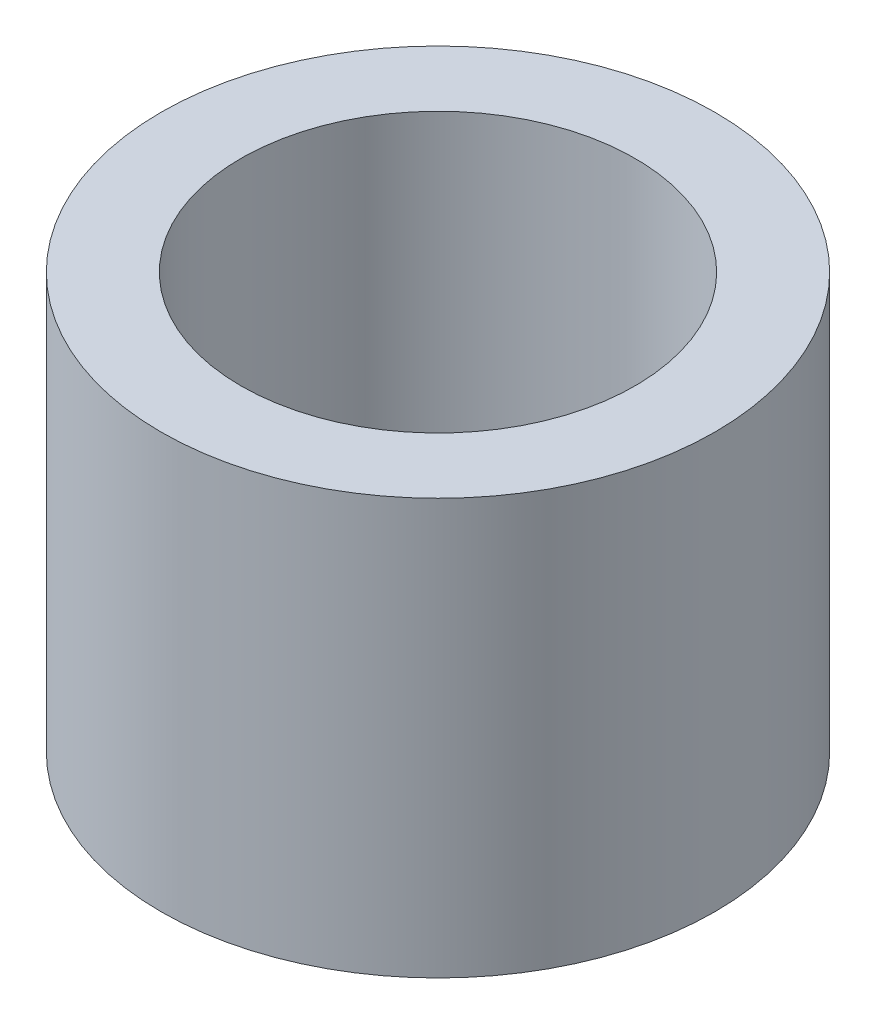
ISO-10303-21;
HEADER;
FILE_DESCRIPTION(('STEP AP214'),'2;1');
FILE_NAME('part.step','',(''),(''),'','','');
FILE_SCHEMA(('AUTOMOTIVE_DESIGN { 1 0 10303 214 1 1 1 1 }'));
ENDSEC;
DATA;
#1=APPLICATION_CONTEXT('core data for automotive mechanical design processes');
#2=APPLICATION_PROTOCOL_DEFINITION('international standard','automotive_design',2000,#1);
#3=PRODUCT_CONTEXT('',#1,'mechanical');
#4=PRODUCT('Part','Part','',(#3));
#5=PRODUCT_RELATED_PRODUCT_CATEGORY('part','',(#4));
#6=PRODUCT_DEFINITION_FORMATION('','',#4);
#7=PRODUCT_DEFINITION_CONTEXT('part definition',#1,'design');
#8=PRODUCT_DEFINITION('design','',#6,#7);
#9=PRODUCT_DEFINITION_SHAPE('','',#8);
#10=(LENGTH_UNIT() NAMED_UNIT(*) SI_UNIT(.MILLI.,.METRE.));
#11=(NAMED_UNIT(*) PLANE_ANGLE_UNIT() SI_UNIT($,.RADIAN.));
#12=(NAMED_UNIT(*) SI_UNIT($,.STERADIAN.) SOLID_ANGLE_UNIT());
#13=UNCERTAINTY_MEASURE_WITH_UNIT(LENGTH_MEASURE(1.E-05),#10,'distance_accuracy_value','');
#14=(GEOMETRIC_REPRESENTATION_CONTEXT(3) GLOBAL_UNCERTAINTY_ASSIGNED_CONTEXT((#13)) GLOBAL_UNIT_ASSIGNED_CONTEXT((#10,
#11,#12)) REPRESENTATION_CONTEXT('',''));
#15=CARTESIAN_POINT('',(0.,0.,0.));
#16=DIRECTION('',(0.,0.,1.));
#17=DIRECTION('',(1.,0.,0.));
#18=AXIS2_PLACEMENT_3D('',#15,#16,#17);
#19=CARTESIAN_POINT('',(0.,75.,0.));
#20=DIRECTION('',(0.,1.,0.));
#21=DIRECTION('',(0.,0.,1.));
#22=AXIS2_PLACEMENT_3D('',#19,#20,#21);
#23=PLANE('',#22);
#24=CARTESIAN_POINT('',(0.,75.,0.));
#25=DIRECTION('',(0.,1.,0.));
#26=DIRECTION('',(0.,0.,1.));
#27=AXIS2_PLACEMENT_3D('',#24,#25,#26);
#28=CIRCLE('',#27,50.);
#29=CARTESIAN_POINT('',(0.,75.,50.));
#30=VERTEX_POINT('',#29);
#31=EDGE_CURVE('E11',#30,#30,#28,.T.);
#32=ORIENTED_EDGE('',*,*,#31,.T.);
#33=EDGE_LOOP('',(#32));
#34=FACE_BOUND('',#33,.T.);
#35=CARTESIAN_POINT('',(0.,75.,0.));
#36=DIRECTION('',(0.,1.,0.));
#37=DIRECTION('',(0.,0.,1.));
#38=AXIS2_PLACEMENT_3D('',#35,#36,#37);
#39=CIRCLE('',#38,35.575);
#40=CARTESIAN_POINT('',(0.,75.,35.575));
#41=VERTEX_POINT('',#40);
#42=EDGE_CURVE('E56',#41,#41,#39,.T.);
#43=ORIENTED_EDGE('',*,*,#42,.F.);
#44=EDGE_LOOP('',(#43));
#45=FACE_BOUND('',#44,.T.);
#46=ADVANCED_FACE('F43',(#34,#45),#23,.T.);
#47=CARTESIAN_POINT('',(0.,0.,0.));
#48=DIRECTION('',(0.,1.,0.));
#49=DIRECTION('',(0.,0.,1.));
#50=AXIS2_PLACEMENT_3D('',#47,#48,#49);
#51=PLANE('',#50);
#52=CARTESIAN_POINT('',(0.,0.,0.));
#53=DIRECTION('',(0.,1.,0.));
#54=DIRECTION('',(0.,0.,1.));
#55=AXIS2_PLACEMENT_3D('',#52,#53,#54);
#56=CIRCLE('',#55,50.);
#57=CARTESIAN_POINT('',(0.,0.,50.));
#58=VERTEX_POINT('',#57);
#59=EDGE_CURVE('E47',#58,#58,#56,.T.);
#60=ORIENTED_EDGE('',*,*,#59,.F.);
#61=EDGE_LOOP('',(#60));
#62=FACE_BOUND('',#61,.T.);
#63=CARTESIAN_POINT('',(0.,0.,0.));
#64=DIRECTION('',(0.,1.,0.));
#65=DIRECTION('',(0.,0.,1.));
#66=AXIS2_PLACEMENT_3D('',#63,#64,#65);
#67=CIRCLE('',#66,35.575);
#68=CARTESIAN_POINT('',(0.,0.,35.575));
#69=VERTEX_POINT('',#68);
#70=EDGE_CURVE('E58',#69,#69,#67,.T.);
#71=ORIENTED_EDGE('',*,*,#70,.T.);
#72=EDGE_LOOP('',(#71));
#73=FACE_BOUND('',#72,.T.);
#74=ADVANCED_FACE('F70',(#62,#73),#51,.F.);
#75=CARTESIAN_POINT('',(0.,75.,0.));
#76=DIRECTION('',(0.,-1.,0.));
#77=DIRECTION('',(0.,0.,-1.));
#78=AXIS2_PLACEMENT_3D('',#75,#76,#77);
#79=CYLINDRICAL_SURFACE('',#78,50.);
#80=ORIENTED_EDGE('',*,*,#31,.F.);
#81=EDGE_LOOP('',(#80));
#82=FACE_BOUND('',#81,.T.);
#83=ORIENTED_EDGE('',*,*,#59,.T.);
#84=EDGE_LOOP('',(#83));
#85=FACE_BOUND('',#84,.T.);
#86=ADVANCED_FACE('F45',(#82,#85),#79,.T.);
#87=CARTESIAN_POINT('',(0.,75.,0.));
#88=DIRECTION('',(0.,-1.,0.));
#89=DIRECTION('',(0.,0.,-1.));
#90=AXIS2_PLACEMENT_3D('',#87,#88,#89);
#91=CYLINDRICAL_SURFACE('',#90,35.575);
#92=ORIENTED_EDGE('',*,*,#42,.T.);
#93=EDGE_LOOP('',(#92));
#94=FACE_BOUND('',#93,.T.);
#95=ORIENTED_EDGE('',*,*,#70,.F.);
#96=EDGE_LOOP('',(#95));
#97=FACE_BOUND('',#96,.T.);
#98=ADVANCED_FACE('F66',(#94,#97),#91,.F.);
#99=CLOSED_SHELL('',(#46,#74,#86,#98));
#100=MANIFOLD_SOLID_BREP('B2',#99);
#101=ADVANCED_BREP_SHAPE_REPRESENTATION('',(#18,#100),#14);
#102=SHAPE_DEFINITION_REPRESENTATION(#9,#101);
ENDSEC;
END-ISO-10303-21;
